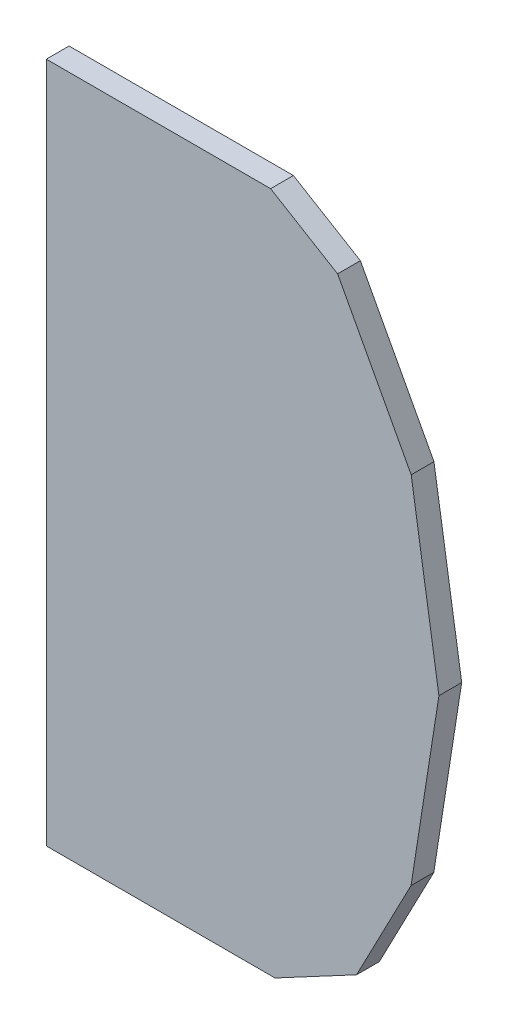
ISO-10303-21;
HEADER;
FILE_DESCRIPTION(('STEP AP214'),'2;1');
FILE_NAME('part.step','',(''),(''),'','','');
FILE_SCHEMA(('AUTOMOTIVE_DESIGN { 1 0 10303 214 1 1 1 1 }'));
ENDSEC;
DATA;
#1=APPLICATION_CONTEXT('core data for automotive mechanical design processes');
#2=APPLICATION_PROTOCOL_DEFINITION('international standard','automotive_design',2000,#1);
#3=PRODUCT_CONTEXT('',#1,'mechanical');
#4=PRODUCT('Part','Part','',(#3));
#5=PRODUCT_RELATED_PRODUCT_CATEGORY('part','',(#4));
#6=PRODUCT_DEFINITION_FORMATION('','',#4);
#7=PRODUCT_DEFINITION_CONTEXT('part definition',#1,'design');
#8=PRODUCT_DEFINITION('design','',#6,#7);
#9=PRODUCT_DEFINITION_SHAPE('','',#8);
#10=(LENGTH_UNIT() NAMED_UNIT(*) SI_UNIT(.MILLI.,.METRE.));
#11=(NAMED_UNIT(*) PLANE_ANGLE_UNIT() SI_UNIT($,.RADIAN.));
#12=(NAMED_UNIT(*) SI_UNIT($,.STERADIAN.) SOLID_ANGLE_UNIT());
#13=UNCERTAINTY_MEASURE_WITH_UNIT(LENGTH_MEASURE(1.E-05),#10,'distance_accuracy_value','');
#14=(GEOMETRIC_REPRESENTATION_CONTEXT(3) GLOBAL_UNCERTAINTY_ASSIGNED_CONTEXT((#13)) GLOBAL_UNIT_ASSIGNED_CONTEXT((#10,
#11,#12)) REPRESENTATION_CONTEXT('',''));
#15=CARTESIAN_POINT('',(0.,0.,0.));
#16=DIRECTION('',(0.,0.,1.));
#17=DIRECTION('',(1.,0.,0.));
#18=AXIS2_PLACEMENT_3D('',#15,#16,#17);
#19=CARTESIAN_POINT('',(32.663016167213,48.578799233762,1.1595000001));
#20=DIRECTION('',(0.,0.,1.));
#21=DIRECTION('',(1.,0.,0.));
#22=AXIS2_PLACEMENT_3D('',#19,#20,#21);
#23=PLANE('',#22);
#24=DIRECTION('',(-0.472548921208732,0.8813044406245,0.));
#25=VECTOR('',#24,1.);
#26=CARTESIAN_POINT('',(32.732390136719,48.747534179688,1.1595000001));
#27=LINE('',#26,#25);
#28=CARTESIAN_POINT('',(32.773442382812,48.670971679687,1.1595000001));
#29=VERTEX_POINT('',#28);
#30=CARTESIAN_POINT('',(32.732390136719,48.747534179688,1.1595000001));
#31=VERTEX_POINT('',#30);
#32=EDGE_CURVE('E169',#29,#31,#27,.T.);
#33=ORIENTED_EDGE('',*,*,#32,.T.);
#34=DIRECTION('',(-0.857008319496514,0.515302571615708,0.));
#35=VECTOR('',#34,1.);
#36=CARTESIAN_POINT('',(32.695026855469,48.77,1.1595000001));
#37=LINE('',#36,#35);
#38=CARTESIAN_POINT('',(32.695026855469,48.77,1.1595000001));
#39=VERTEX_POINT('',#38);
#40=EDGE_CURVE('E154',#31,#39,#37,.T.);
#41=ORIENTED_EDGE('',*,*,#40,.T.);
#42=DIRECTION('',(-1.,0.,0.));
#43=VECTOR('',#42,1.);
#44=CARTESIAN_POINT('',(32.569899902344,48.77,1.1595000001));
#45=LINE('',#44,#43);
#46=CARTESIAN_POINT('',(32.569899902344,48.77,1.1595000001));
#47=VERTEX_POINT('',#46);
#48=EDGE_CURVE('E155',#39,#47,#45,.T.);
#49=ORIENTED_EDGE('',*,*,#48,.T.);
#50=DIRECTION('',(0.,-1.,0.));
#51=VECTOR('',#50,1.);
#52=CARTESIAN_POINT('',(32.569899902344,48.389897460937,1.1595000001));
#53=LINE('',#52,#51);
#54=CARTESIAN_POINT('',(32.569899902344,48.389897460937,1.1595000001));
#55=VERTEX_POINT('',#54);
#56=EDGE_CURVE('E11',#47,#55,#53,.T.);
#57=ORIENTED_EDGE('',*,*,#56,.T.);
#58=DIRECTION('',(1.,0.,0.));
#59=VECTOR('',#58,1.);
#60=CARTESIAN_POINT('',(32.697478027344,48.389897460937,1.1595000001));
#61=LINE('',#60,#59);
#62=CARTESIAN_POINT('',(32.697478027344,48.389897460937,1.1595000001));
#63=VERTEX_POINT('',#62);
#64=EDGE_CURVE('E27',#55,#63,#61,.T.);
#65=ORIENTED_EDGE('',*,*,#64,.T.);
#66=DIRECTION('',(0.882106397098983,0.471050214092991,0.));
#67=VECTOR('',#66,1.);
#68=CARTESIAN_POINT('',(32.742958984375,48.414184570313,1.1595000001));
#69=LINE('',#68,#67);
#70=CARTESIAN_POINT('',(32.742958984375,48.414184570313,1.1595000001));
#71=VERTEX_POINT('',#70);
#72=EDGE_CURVE('E112',#63,#71,#69,.T.);
#73=ORIENTED_EDGE('',*,*,#72,.T.);
#74=DIRECTION('',(0.462296998837031,0.886725146179059,0.));
#75=VECTOR('',#74,1.);
#76=CARTESIAN_POINT('',(32.773359375,48.472495117187,1.1595000001));
#77=LINE('',#76,#75);
#78=CARTESIAN_POINT('',(32.773359375,48.472495117187,1.1595000001));
#79=VERTEX_POINT('',#78);
#80=EDGE_CURVE('E108',#71,#79,#77,.T.);
#81=ORIENTED_EDGE('',*,*,#80,.T.);
#82=DIRECTION('',(0.154397586505026,0.988008798180169,0.));
#83=VECTOR('',#82,1.);
#84=CARTESIAN_POINT('',(32.788908691406,48.571997070312,1.1595000001));
#85=LINE('',#84,#83);
#86=CARTESIAN_POINT('',(32.788908691406,48.571997070312,1.1595000001));
#87=VERTEX_POINT('',#86);
#88=EDGE_CURVE('E110',#79,#87,#85,.T.);
#89=ORIENTED_EDGE('',*,*,#88,.T.);
#90=DIRECTION('',(-0.154391749262984,0.988009710356895,0.));
#91=VECTOR('',#90,1.);
#92=CARTESIAN_POINT('',(32.773442382812,48.670971679688,1.1595000001));
#93=LINE('',#92,#91);
#94=EDGE_CURVE('E21',#87,#29,#93,.T.);
#95=ORIENTED_EDGE('',*,*,#94,.T.);
#96=EDGE_LOOP('',(#33,#41,#49,#57,#65,#73,#81,#89,#95));
#97=FACE_BOUND('',#96,.T.);
#98=ADVANCED_FACE('F17',(#97),#23,.T.);
#99=CARTESIAN_POINT('',(32.569899902344,48.389897460937,1.1468000001));
#100=DIRECTION('',(1.,0.,0.));
#101=DIRECTION('',(0.,1.,0.));
#102=AXIS2_PLACEMENT_3D('',#99,#100,#101);
#103=PLANE('',#102);
#104=DIRECTION('',(0.,0.,-1.));
#105=VECTOR('',#104,1.);
#106=CARTESIAN_POINT('',(32.569899902344,48.77,1.1468000001));
#107=LINE('',#106,#105);
#108=CARTESIAN_POINT('',(32.569899902344,48.77,1.1468000001));
#109=VERTEX_POINT('',#108);
#110=EDGE_CURVE('E160',#47,#109,#107,.T.);
#111=ORIENTED_EDGE('',*,*,#110,.T.);
#112=DIRECTION('',(0.,-1.,0.));
#113=VECTOR('',#112,1.);
#114=CARTESIAN_POINT('',(32.569899902344,48.578799233762,1.1468000001));
#115=LINE('',#114,#113);
#116=CARTESIAN_POINT('',(32.569899902344,48.389897460937,1.1468000001));
#117=VERTEX_POINT('',#116);
#118=EDGE_CURVE('E183',#109,#117,#115,.T.);
#119=ORIENTED_EDGE('',*,*,#118,.T.);
#120=DIRECTION('',(0.,0.,1.));
#121=VECTOR('',#120,1.);
#122=CARTESIAN_POINT('',(32.569899902344,48.389897460937,1.1468000001));
#123=LINE('',#122,#121);
#124=EDGE_CURVE('E149',#117,#55,#123,.T.);
#125=ORIENTED_EDGE('',*,*,#124,.T.);
#126=ORIENTED_EDGE('',*,*,#56,.F.);
#127=EDGE_LOOP('',(#111,#119,#125,#126));
#128=FACE_BOUND('',#127,.T.);
#129=ADVANCED_FACE('F311',(#128),#103,.F.);
#130=CARTESIAN_POINT('',(32.697478027344,48.389897460937,1.1468000001));
#131=DIRECTION('',(0.,1.,0.));
#132=DIRECTION('',(1.,0.,0.));
#133=AXIS2_PLACEMENT_3D('',#130,#131,#132);
#134=PLANE('',#133);
#135=ORIENTED_EDGE('',*,*,#124,.F.);
#136=DIRECTION('',(1.,0.,0.));
#137=VECTOR('',#136,1.);
#138=CARTESIAN_POINT('',(32.663016167213,48.389897460937,1.1468000001));
#139=LINE('',#138,#137);
#140=CARTESIAN_POINT('',(32.697478027344,48.389897460937,1.1468000001));
#141=VERTEX_POINT('',#140);
#142=EDGE_CURVE('E164',#117,#141,#139,.T.);
#143=ORIENTED_EDGE('',*,*,#142,.T.);
#144=DIRECTION('',(0.,0.,1.));
#145=VECTOR('',#144,1.);
#146=CARTESIAN_POINT('',(32.697478027344,48.389897460937,1.1468000001));
#147=LINE('',#146,#145);
#148=EDGE_CURVE('E117',#141,#63,#147,.T.);
#149=ORIENTED_EDGE('',*,*,#148,.T.);
#150=ORIENTED_EDGE('',*,*,#64,.F.);
#151=EDGE_LOOP('',(#135,#143,#149,#150));
#152=FACE_BOUND('',#151,.T.);
#153=ADVANCED_FACE('F287',(#152),#134,.F.);
#154=CARTESIAN_POINT('',(32.742958984375,48.414184570313,1.1468000001));
#155=DIRECTION('',(-0.471050214092991,0.882106397098983,0.));
#156=DIRECTION('',(0.,0.,1.));
#157=AXIS2_PLACEMENT_3D('',#154,#155,#156);
#158=PLANE('',#157);
#159=ORIENTED_EDGE('',*,*,#148,.F.);
#160=DIRECTION('',(0.882106397098983,0.471050214092991,0.));
#161=VECTOR('',#160,1.);
#162=CARTESIAN_POINT('',(32.697478027344,48.389897460937,1.1468000001));
#163=LINE('',#162,#161);
#164=CARTESIAN_POINT('',(32.742958984375,48.414184570313,1.1468000001));
#165=VERTEX_POINT('',#164);
#166=EDGE_CURVE('E145',#141,#165,#163,.T.);
#167=ORIENTED_EDGE('',*,*,#166,.T.);
#168=DIRECTION('',(0.,0.,1.));
#169=VECTOR('',#168,1.);
#170=CARTESIAN_POINT('',(32.742958984375,48.414184570313,1.1468000001));
#171=LINE('',#170,#169);
#172=EDGE_CURVE('E118',#165,#71,#171,.T.);
#173=ORIENTED_EDGE('',*,*,#172,.T.);
#174=ORIENTED_EDGE('',*,*,#72,.F.);
#175=EDGE_LOOP('',(#159,#167,#173,#174));
#176=FACE_BOUND('',#175,.T.);
#177=ADVANCED_FACE('F291',(#176),#158,.F.);
#178=CARTESIAN_POINT('',(32.773359375,48.472495117187,1.1468000001));
#179=DIRECTION('',(-0.886725146179059,0.462296998837031,0.));
#180=DIRECTION('',(0.,0.,1.));
#181=AXIS2_PLACEMENT_3D('',#178,#179,#180);
#182=PLANE('',#181);
#183=ORIENTED_EDGE('',*,*,#172,.F.);
#184=DIRECTION('',(0.462296998837031,0.886725146179059,0.));
#185=VECTOR('',#184,1.);
#186=CARTESIAN_POINT('',(32.742958984375,48.414184570313,1.1468000001));
#187=LINE('',#186,#185);
#188=CARTESIAN_POINT('',(32.773359375,48.472495117187,1.1468000001));
#189=VERTEX_POINT('',#188);
#190=EDGE_CURVE('E131',#165,#189,#187,.T.);
#191=ORIENTED_EDGE('',*,*,#190,.T.);
#192=DIRECTION('',(0.,0.,1.));
#193=VECTOR('',#192,1.);
#194=CARTESIAN_POINT('',(32.773359375,48.472495117188,1.1468000001));
#195=LINE('',#194,#193);
#196=EDGE_CURVE('E124',#189,#79,#195,.T.);
#197=ORIENTED_EDGE('',*,*,#196,.T.);
#198=ORIENTED_EDGE('',*,*,#80,.F.);
#199=EDGE_LOOP('',(#183,#191,#197,#198));
#200=FACE_BOUND('',#199,.T.);
#201=ADVANCED_FACE('F129',(#200),#182,.F.);
#202=CARTESIAN_POINT('',(32.788908691406,48.571997070312,1.1468000001));
#203=DIRECTION('',(-0.988008798180169,0.154397586505026,0.));
#204=DIRECTION('',(0.,0.,1.));
#205=AXIS2_PLACEMENT_3D('',#202,#203,#204);
#206=PLANE('',#205);
#207=ORIENTED_EDGE('',*,*,#196,.F.);
#208=DIRECTION('',(0.154397586505026,0.988008798180169,0.));
#209=VECTOR('',#208,1.);
#210=CARTESIAN_POINT('',(32.773359375,48.472495117187,1.1468000001));
#211=LINE('',#210,#209);
#212=CARTESIAN_POINT('',(32.788908691406,48.571997070312,1.1468000001));
#213=VERTEX_POINT('',#212);
#214=EDGE_CURVE('E146',#189,#213,#211,.T.);
#215=ORIENTED_EDGE('',*,*,#214,.T.);
#216=DIRECTION('',(0.,0.,1.));
#217=VECTOR('',#216,1.);
#218=CARTESIAN_POINT('',(32.788908691406,48.571997070313,1.1468000001));
#219=LINE('',#218,#217);
#220=EDGE_CURVE('E126',#213,#87,#219,.T.);
#221=ORIENTED_EDGE('',*,*,#220,.T.);
#222=ORIENTED_EDGE('',*,*,#88,.F.);
#223=EDGE_LOOP('',(#207,#215,#221,#222));
#224=FACE_BOUND('',#223,.T.);
#225=ADVANCED_FACE('F122',(#224),#206,.F.);
#226=CARTESIAN_POINT('',(32.773442382812,48.670971679688,1.1468000001));
#227=DIRECTION('',(-0.988009710356895,-0.154391749262984,0.));
#228=DIRECTION('',(-0.154391749262984,0.988009710356895,0.));
#229=AXIS2_PLACEMENT_3D('',#226,#227,#228);
#230=PLANE('',#229);
#231=ORIENTED_EDGE('',*,*,#220,.F.);
#232=DIRECTION('',(-0.154391749262008,0.988009710357048,0.));
#233=VECTOR('',#232,1.);
#234=CARTESIAN_POINT('',(32.788908691406,48.571997070312,1.1468000001));
#235=LINE('',#234,#233);
#236=CARTESIAN_POINT('',(32.773442382812,48.670971679687,1.1468000001));
#237=VERTEX_POINT('',#236);
#238=EDGE_CURVE('E168',#213,#237,#235,.T.);
#239=ORIENTED_EDGE('',*,*,#238,.T.);
#240=DIRECTION('',(0.,0.,1.));
#241=VECTOR('',#240,1.);
#242=CARTESIAN_POINT('',(32.773442382812,48.670971679687,1.1468000001));
#243=LINE('',#242,#241);
#244=EDGE_CURVE('E141',#237,#29,#243,.T.);
#245=ORIENTED_EDGE('',*,*,#244,.T.);
#246=ORIENTED_EDGE('',*,*,#94,.F.);
#247=EDGE_LOOP('',(#231,#239,#245,#246));
#248=FACE_BOUND('',#247,.T.);
#249=ADVANCED_FACE('F298',(#248),#230,.F.);
#250=CARTESIAN_POINT('',(32.732390136719,48.747534179688,1.1468000001));
#251=DIRECTION('',(-0.8813044406245,-0.472548921208732,0.));
#252=DIRECTION('',(-0.472548921208732,0.8813044406245,0.));
#253=AXIS2_PLACEMENT_3D('',#250,#251,#252);
#254=PLANE('',#253);
#255=ORIENTED_EDGE('',*,*,#244,.F.);
#256=DIRECTION('',(-0.472548921209149,0.881304440624277,0.));
#257=VECTOR('',#256,1.);
#258=CARTESIAN_POINT('',(32.773442382812,48.670971679688,1.1468000001));
#259=LINE('',#258,#257);
#260=CARTESIAN_POINT('',(32.732390136719,48.747534179688,1.1468000001));
#261=VERTEX_POINT('',#260);
#262=EDGE_CURVE('E175',#237,#261,#259,.T.);
#263=ORIENTED_EDGE('',*,*,#262,.T.);
#264=DIRECTION('',(0.,0.,1.));
#265=VECTOR('',#264,1.);
#266=CARTESIAN_POINT('',(32.732390136719,48.747534179688,1.1468000001));
#267=LINE('',#266,#265);
#268=EDGE_CURVE('E150',#261,#31,#267,.T.);
#269=ORIENTED_EDGE('',*,*,#268,.T.);
#270=ORIENTED_EDGE('',*,*,#32,.F.);
#271=EDGE_LOOP('',(#255,#263,#269,#270));
#272=FACE_BOUND('',#271,.T.);
#273=ADVANCED_FACE('F302',(#272),#254,.F.);
#274=CARTESIAN_POINT('',(32.695026855469,48.77,1.1468000001));
#275=DIRECTION('',(-0.515302571615708,-0.857008319496514,0.));
#276=DIRECTION('',(-0.857008319496514,0.515302571615708,0.));
#277=AXIS2_PLACEMENT_3D('',#274,#275,#276);
#278=PLANE('',#277);
#279=ORIENTED_EDGE('',*,*,#268,.F.);
#280=DIRECTION('',(-0.857008319495807,0.515302571616884,0.));
#281=VECTOR('',#280,1.);
#282=CARTESIAN_POINT('',(32.732390136719,48.747534179688,1.1468000001));
#283=LINE('',#282,#281);
#284=CARTESIAN_POINT('',(32.695026855469,48.77,1.1468000001));
#285=VERTEX_POINT('',#284);
#286=EDGE_CURVE('E179',#261,#285,#283,.T.);
#287=ORIENTED_EDGE('',*,*,#286,.T.);
#288=DIRECTION('',(0.,0.,1.));
#289=VECTOR('',#288,1.);
#290=CARTESIAN_POINT('',(32.695026855469,48.77,1.1468000001));
#291=LINE('',#290,#289);
#292=EDGE_CURVE('E156',#285,#39,#291,.T.);
#293=ORIENTED_EDGE('',*,*,#292,.T.);
#294=ORIENTED_EDGE('',*,*,#40,.F.);
#295=EDGE_LOOP('',(#279,#287,#293,#294));
#296=FACE_BOUND('',#295,.T.);
#297=ADVANCED_FACE('F19',(#296),#278,.F.);
#298=CARTESIAN_POINT('',(32.569899902344,48.77,1.1468000001));
#299=DIRECTION('',(0.,-1.,0.));
#300=DIRECTION('',(0.,0.,-1.));
#301=AXIS2_PLACEMENT_3D('',#298,#299,#300);
#302=PLANE('',#301);
#303=ORIENTED_EDGE('',*,*,#292,.F.);
#304=DIRECTION('',(-1.,0.,0.));
#305=VECTOR('',#304,1.);
#306=CARTESIAN_POINT('',(32.663016167213,48.77,1.1468000001));
#307=LINE('',#306,#305);
#308=EDGE_CURVE('E161',#285,#109,#307,.T.);
#309=ORIENTED_EDGE('',*,*,#308,.T.);
#310=ORIENTED_EDGE('',*,*,#110,.F.);
#311=ORIENTED_EDGE('',*,*,#48,.F.);
#312=EDGE_LOOP('',(#303,#309,#310,#311));
#313=FACE_BOUND('',#312,.T.);
#314=ADVANCED_FACE('F307',(#313),#302,.F.);
#315=CARTESIAN_POINT('',(32.663016167213,48.578799233762,1.1468000001));
#316=DIRECTION('',(0.,0.,1.));
#317=DIRECTION('',(1.,0.,0.));
#318=AXIS2_PLACEMENT_3D('',#315,#316,#317);
#319=PLANE('',#318);
#320=ORIENTED_EDGE('',*,*,#286,.F.);
#321=ORIENTED_EDGE('',*,*,#262,.F.);
#322=ORIENTED_EDGE('',*,*,#238,.F.);
#323=ORIENTED_EDGE('',*,*,#214,.F.);
#324=ORIENTED_EDGE('',*,*,#190,.F.);
#325=ORIENTED_EDGE('',*,*,#166,.F.);
#326=ORIENTED_EDGE('',*,*,#142,.F.);
#327=ORIENTED_EDGE('',*,*,#118,.F.);
#328=ORIENTED_EDGE('',*,*,#308,.F.);
#329=EDGE_LOOP('',(#320,#321,#322,#323,#324,#325,#326,#327,#328));
#330=FACE_BOUND('',#329,.T.);
#331=ADVANCED_FACE('F294',(#330),#319,.F.);
#332=CLOSED_SHELL('',(#98,#129,#153,#177,#201,#225,#249,#273,#297,#314,#331));
#333=MANIFOLD_SOLID_BREP('B1',#332);
#334=ADVANCED_BREP_SHAPE_REPRESENTATION('',(#18,#333),#14);
#335=SHAPE_DEFINITION_REPRESENTATION(#9,#334);
ENDSEC;
END-ISO-10303-21;
